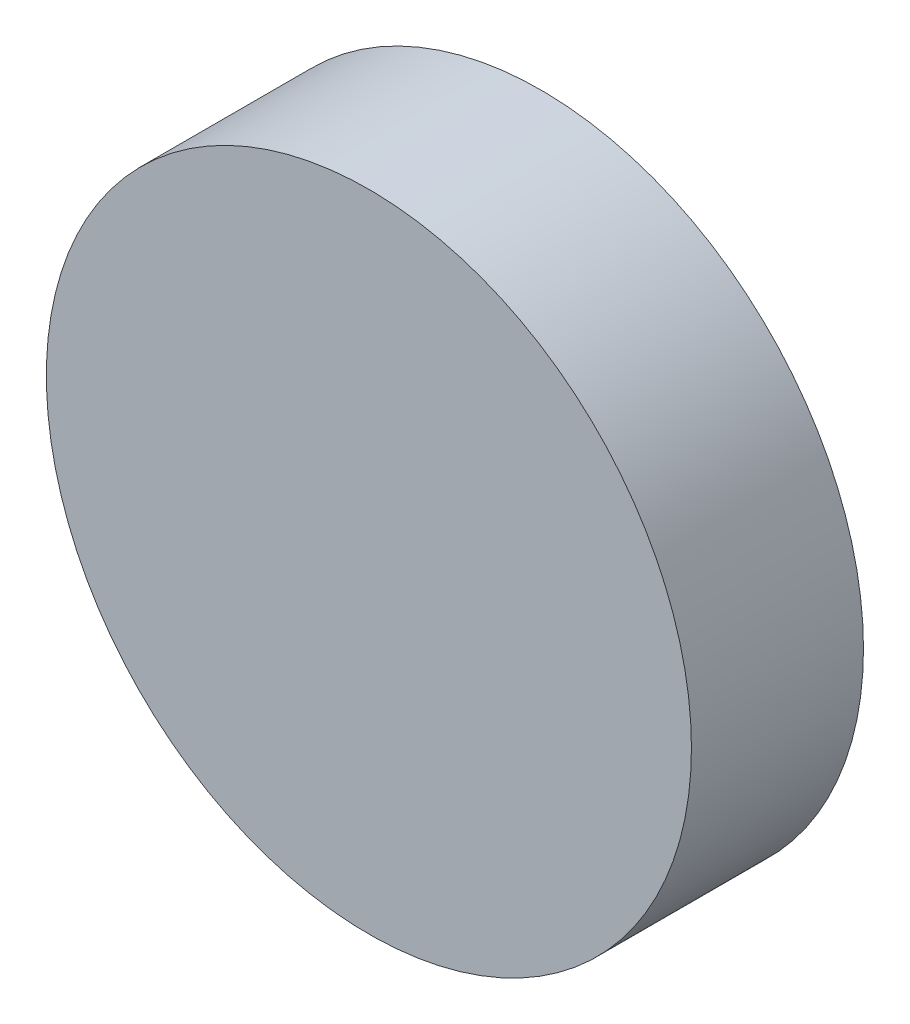
ISO-10303-21;
HEADER;
FILE_DESCRIPTION(('STEP AP214'),'2;1');
FILE_NAME('part.step','',(''),(''),'','','');
FILE_SCHEMA(('AUTOMOTIVE_DESIGN { 1 0 10303 214 1 1 1 1 }'));
ENDSEC;
DATA;
#1=APPLICATION_CONTEXT('core data for automotive mechanical design processes');
#2=APPLICATION_PROTOCOL_DEFINITION('international standard','automotive_design',2000,#1);
#3=PRODUCT_CONTEXT('',#1,'mechanical');
#4=PRODUCT('Part','Part','',(#3));
#5=PRODUCT_RELATED_PRODUCT_CATEGORY('part','',(#4));
#6=PRODUCT_DEFINITION_FORMATION('','',#4);
#7=PRODUCT_DEFINITION_CONTEXT('part definition',#1,'design');
#8=PRODUCT_DEFINITION('design','',#6,#7);
#9=PRODUCT_DEFINITION_SHAPE('','',#8);
#10=(LENGTH_UNIT() NAMED_UNIT(*) SI_UNIT(.MILLI.,.METRE.));
#11=(NAMED_UNIT(*) PLANE_ANGLE_UNIT() SI_UNIT($,.RADIAN.));
#12=(NAMED_UNIT(*) SI_UNIT($,.STERADIAN.) SOLID_ANGLE_UNIT());
#13=UNCERTAINTY_MEASURE_WITH_UNIT(LENGTH_MEASURE(1.E-05),#10,'distance_accuracy_value','');
#14=(GEOMETRIC_REPRESENTATION_CONTEXT(3) GLOBAL_UNCERTAINTY_ASSIGNED_CONTEXT((#13)) GLOBAL_UNIT_ASSIGNED_CONTEXT((#10,
#11,#12)) REPRESENTATION_CONTEXT('',''));
#15=CARTESIAN_POINT('',(0.,0.,0.));
#16=DIRECTION('',(0.,0.,1.));
#17=DIRECTION('',(1.,0.,0.));
#18=AXIS2_PLACEMENT_3D('',#15,#16,#17);
#19=CARTESIAN_POINT('',(0.,0.,20.));
#20=DIRECTION('',(0.,0.,-1.));
#21=DIRECTION('',(-1.,0.,0.));
#22=AXIS2_PLACEMENT_3D('',#19,#20,#21);
#23=CYLINDRICAL_SURFACE('',#22,37.5);
#24=CARTESIAN_POINT('',(0.,0.,20.));
#25=DIRECTION('',(0.,0.,1.));
#26=DIRECTION('',(1.,0.,0.));
#27=AXIS2_PLACEMENT_3D('',#24,#25,#26);
#28=CIRCLE('',#27,37.5);
#29=CARTESIAN_POINT('',(37.5,0.,20.));
#30=VERTEX_POINT('',#29);
#31=EDGE_CURVE('E12',#30,#30,#28,.T.);
#32=ORIENTED_EDGE('',*,*,#31,.F.);
#33=EDGE_LOOP('',(#32));
#34=FACE_BOUND('',#33,.T.);
#35=CARTESIAN_POINT('',(0.,0.,0.));
#36=DIRECTION('',(0.,0.,1.));
#37=DIRECTION('',(1.,0.,0.));
#38=AXIS2_PLACEMENT_3D('',#35,#36,#37);
#39=CIRCLE('',#38,37.5);
#40=CARTESIAN_POINT('',(37.5,0.,0.));
#41=VERTEX_POINT('',#40);
#42=EDGE_CURVE('E50',#41,#41,#39,.T.);
#43=ORIENTED_EDGE('',*,*,#42,.T.);
#44=EDGE_LOOP('',(#43));
#45=FACE_BOUND('',#44,.T.);
#46=ADVANCED_FACE('F47',(#34,#45),#23,.T.);
#47=CARTESIAN_POINT('',(0.,0.,20.));
#48=DIRECTION('',(0.,0.,1.));
#49=DIRECTION('',(1.,0.,0.));
#50=AXIS2_PLACEMENT_3D('',#47,#48,#49);
#51=PLANE('',#50);
#52=ORIENTED_EDGE('',*,*,#31,.T.);
#53=EDGE_LOOP('',(#52));
#54=FACE_BOUND('',#53,.T.);
#55=ADVANCED_FACE('F64',(#54),#51,.T.);
#56=CARTESIAN_POINT('',(0.,0.,0.));
#57=DIRECTION('',(0.,0.,1.));
#58=DIRECTION('',(1.,0.,0.));
#59=AXIS2_PLACEMENT_3D('',#56,#57,#58);
#60=PLANE('',#59);
#61=ORIENTED_EDGE('',*,*,#42,.F.);
#62=EDGE_LOOP('',(#61));
#63=FACE_BOUND('',#62,.T.);
#64=ADVANCED_FACE('F62',(#63),#60,.F.);
#65=CLOSED_SHELL('',(#46,#55,#64));
#66=MANIFOLD_SOLID_BREP('B2',#65);
#67=ADVANCED_BREP_SHAPE_REPRESENTATION('',(#18,#66),#14);
#68=SHAPE_DEFINITION_REPRESENTATION(#9,#67);
ENDSEC;
END-ISO-10303-21;
